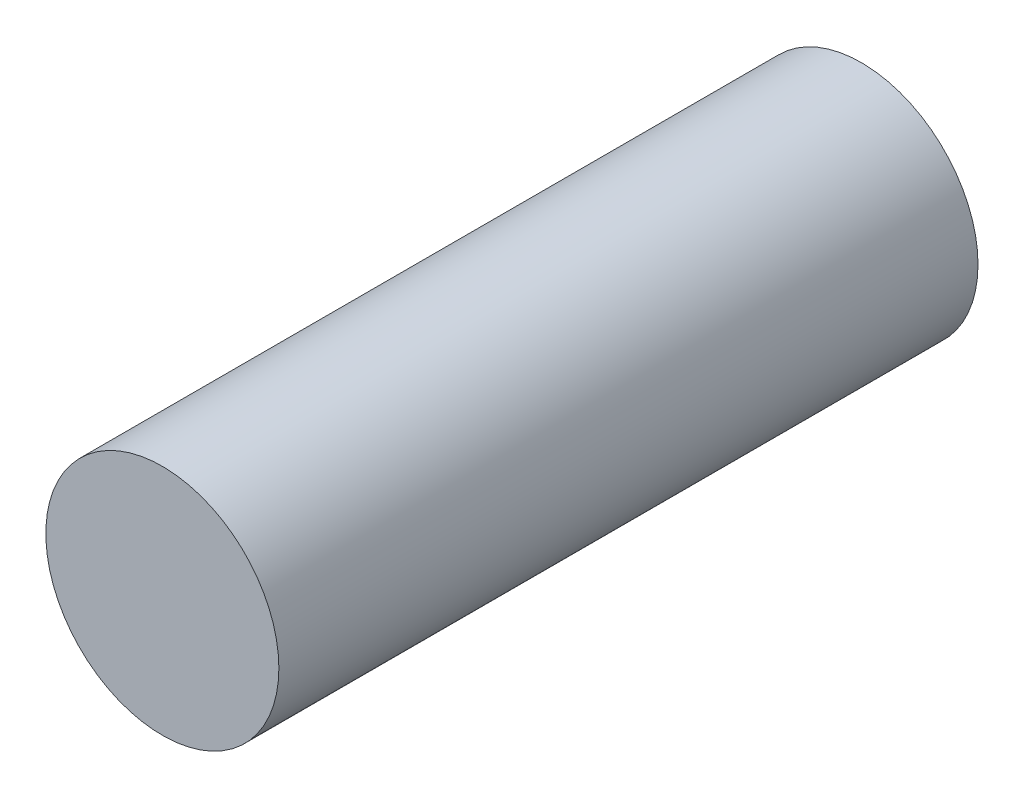
ISO-10303-21;
HEADER;
FILE_DESCRIPTION(('STEP AP214'),'2;1');
FILE_NAME('part.step','',(''),(''),'','','');
FILE_SCHEMA(('AUTOMOTIVE_DESIGN { 1 0 10303 214 1 1 1 1 }'));
ENDSEC;
DATA;
#1=APPLICATION_CONTEXT('core data for automotive mechanical design processes');
#2=APPLICATION_PROTOCOL_DEFINITION('international standard','automotive_design',2000,#1);
#3=PRODUCT_CONTEXT('',#1,'mechanical');
#4=PRODUCT('Part','Part','',(#3));
#5=PRODUCT_RELATED_PRODUCT_CATEGORY('part','',(#4));
#6=PRODUCT_DEFINITION_FORMATION('','',#4);
#7=PRODUCT_DEFINITION_CONTEXT('part definition',#1,'design');
#8=PRODUCT_DEFINITION('design','',#6,#7);
#9=PRODUCT_DEFINITION_SHAPE('','',#8);
#10=(LENGTH_UNIT() NAMED_UNIT(*) SI_UNIT(.MILLI.,.METRE.));
#11=(NAMED_UNIT(*) PLANE_ANGLE_UNIT() SI_UNIT($,.RADIAN.));
#12=(NAMED_UNIT(*) SI_UNIT($,.STERADIAN.) SOLID_ANGLE_UNIT());
#13=UNCERTAINTY_MEASURE_WITH_UNIT(LENGTH_MEASURE(1.E-05),#10,'distance_accuracy_value','');
#14=(GEOMETRIC_REPRESENTATION_CONTEXT(3) GLOBAL_UNCERTAINTY_ASSIGNED_CONTEXT((#13)) GLOBAL_UNIT_ASSIGNED_CONTEXT((#10,
#11,#12)) REPRESENTATION_CONTEXT('',''));
#15=CARTESIAN_POINT('',(0.,0.,0.));
#16=DIRECTION('',(0.,0.,1.));
#17=DIRECTION('',(1.,0.,0.));
#18=AXIS2_PLACEMENT_3D('',#15,#16,#17);
#19=CARTESIAN_POINT('',(0.,0.,30.));
#20=DIRECTION('',(0.,0.,-1.));
#21=DIRECTION('',(-1.,0.,0.));
#22=AXIS2_PLACEMENT_3D('',#19,#20,#21);
#23=CYLINDRICAL_SURFACE('',#22,5.);
#24=CARTESIAN_POINT('',(0.,0.,30.));
#25=DIRECTION('',(0.,0.,1.));
#26=DIRECTION('',(1.,0.,0.));
#27=AXIS2_PLACEMENT_3D('',#24,#25,#26);
#28=CIRCLE('',#27,5.);
#29=CARTESIAN_POINT('',(5.,0.,30.));
#30=VERTEX_POINT('',#29);
#31=EDGE_CURVE('E10',#30,#30,#28,.T.);
#32=ORIENTED_EDGE('',*,*,#31,.F.);
#33=EDGE_LOOP('',(#32));
#34=FACE_BOUND('',#33,.T.);
#35=CARTESIAN_POINT('',(0.,0.,0.));
#36=DIRECTION('',(0.,0.,1.));
#37=DIRECTION('',(1.,0.,0.));
#38=AXIS2_PLACEMENT_3D('',#35,#36,#37);
#39=CIRCLE('',#38,5.);
#40=CARTESIAN_POINT('',(5.,0.,0.));
#41=VERTEX_POINT('',#40);
#42=EDGE_CURVE('E34',#41,#41,#39,.T.);
#43=ORIENTED_EDGE('',*,*,#42,.T.);
#44=EDGE_LOOP('',(#43));
#45=FACE_BOUND('',#44,.T.);
#46=ADVANCED_FACE('F31',(#34,#45),#23,.T.);
#47=CARTESIAN_POINT('',(0.,0.,30.));
#48=DIRECTION('',(0.,0.,1.));
#49=DIRECTION('',(1.,0.,0.));
#50=AXIS2_PLACEMENT_3D('',#47,#48,#49);
#51=PLANE('',#50);
#52=ORIENTED_EDGE('',*,*,#31,.T.);
#53=EDGE_LOOP('',(#52));
#54=FACE_BOUND('',#53,.T.);
#55=ADVANCED_FACE('F60',(#54),#51,.T.);
#56=CARTESIAN_POINT('',(0.,0.,0.));
#57=DIRECTION('',(0.,0.,1.));
#58=DIRECTION('',(1.,0.,0.));
#59=AXIS2_PLACEMENT_3D('',#56,#57,#58);
#60=PLANE('',#59);
#61=CARTESIAN_POINT('',(0.,0.,0.));
#62=DIRECTION('',(0.,0.,-1.));
#63=DIRECTION('',(-1.,0.,0.));
#64=AXIS2_PLACEMENT_3D('',#61,#62,#63);
#65=CIRCLE('',#64,1.75);
#66=CARTESIAN_POINT('',(-1.75,0.,0.));
#67=VERTEX_POINT('',#66);
#68=EDGE_CURVE('E43',#67,#67,#65,.T.);
#69=ORIENTED_EDGE('',*,*,#68,.F.);
#70=EDGE_LOOP('',(#69));
#71=FACE_BOUND('',#70,.T.);
#72=ORIENTED_EDGE('',*,*,#42,.F.);
#73=EDGE_LOOP('',(#72));
#74=FACE_BOUND('',#73,.T.);
#75=ADVANCED_FACE('F54',(#71,#74),#60,.F.);
#76=CARTESIAN_POINT('',(0.,0.,1.));
#77=DIRECTION('',(0.,0.,-1.));
#78=DIRECTION('',(-1.,0.,0.));
#79=AXIS2_PLACEMENT_3D('',#76,#77,#78);
#80=CYLINDRICAL_SURFACE('',#79,1.75);
#81=CARTESIAN_POINT('',(0.,0.,1.));
#82=DIRECTION('',(0.,0.,-1.));
#83=DIRECTION('',(-1.,0.,0.));
#84=AXIS2_PLACEMENT_3D('',#81,#82,#83);
#85=CIRCLE('',#84,1.75);
#86=CARTESIAN_POINT('',(-1.75,0.,1.));
#87=VERTEX_POINT('',#86);
#88=EDGE_CURVE('E41',#87,#87,#85,.T.);
#89=ORIENTED_EDGE('',*,*,#88,.F.);
#90=EDGE_LOOP('',(#89));
#91=FACE_BOUND('',#90,.T.);
#92=ORIENTED_EDGE('',*,*,#68,.T.);
#93=EDGE_LOOP('',(#92));
#94=FACE_BOUND('',#93,.T.);
#95=ADVANCED_FACE('F51',(#91,#94),#80,.F.);
#96=CARTESIAN_POINT('',(0.,0.,1.));
#97=DIRECTION('',(0.,0.,-1.));
#98=DIRECTION('',(-1.,0.,0.));
#99=AXIS2_PLACEMENT_3D('',#96,#97,#98);
#100=PLANE('',#99);
#101=ORIENTED_EDGE('',*,*,#88,.T.);
#102=EDGE_LOOP('',(#101));
#103=FACE_BOUND('',#102,.T.);
#104=ADVANCED_FACE('F49',(#103),#100,.T.);
#105=CLOSED_SHELL('',(#46,#55,#75,#95,#104));
#106=MANIFOLD_SOLID_BREP('B2',#105);
#107=ADVANCED_BREP_SHAPE_REPRESENTATION('',(#18,#106),#14);
#108=SHAPE_DEFINITION_REPRESENTATION(#9,#107);
ENDSEC;
END-ISO-10303-21;
